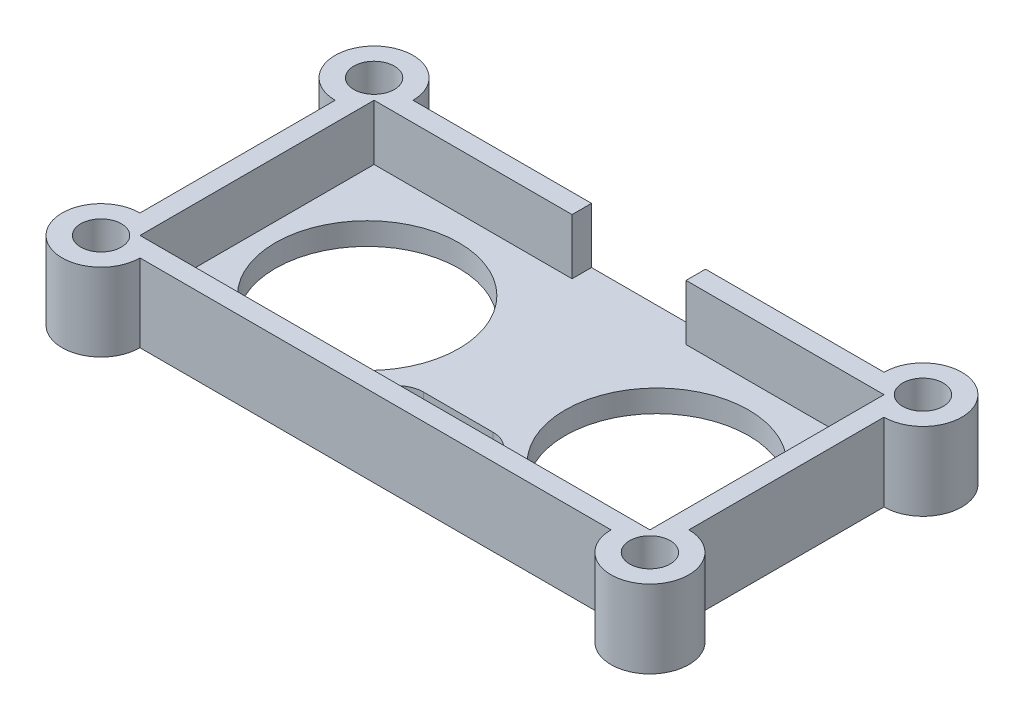
ISO-10303-21;
HEADER;
FILE_DESCRIPTION(('STEP AP214'),'2;1');
FILE_NAME('part.step','',(''),(''),'','','');
FILE_SCHEMA(('AUTOMOTIVE_DESIGN { 1 0 10303 214 1 1 1 1 }'));
ENDSEC;
DATA;
#1=APPLICATION_CONTEXT('core data for automotive mechanical design processes');
#2=APPLICATION_PROTOCOL_DEFINITION('international standard','automotive_design',2000,#1);
#3=PRODUCT_CONTEXT('',#1,'mechanical');
#4=PRODUCT('Part','Part','',(#3));
#5=PRODUCT_RELATED_PRODUCT_CATEGORY('part','',(#4));
#6=PRODUCT_DEFINITION_FORMATION('','',#4);
#7=PRODUCT_DEFINITION_CONTEXT('part definition',#1,'design');
#8=PRODUCT_DEFINITION('design','',#6,#7);
#9=PRODUCT_DEFINITION_SHAPE('','',#8);
#10=(LENGTH_UNIT() NAMED_UNIT(*) SI_UNIT(.MILLI.,.METRE.));
#11=(NAMED_UNIT(*) PLANE_ANGLE_UNIT() SI_UNIT($,.RADIAN.));
#12=(NAMED_UNIT(*) SI_UNIT($,.STERADIAN.) SOLID_ANGLE_UNIT());
#13=UNCERTAINTY_MEASURE_WITH_UNIT(LENGTH_MEASURE(1.E-05),#10,'distance_accuracy_value','');
#14=(GEOMETRIC_REPRESENTATION_CONTEXT(3) GLOBAL_UNCERTAINTY_ASSIGNED_CONTEXT((#13)) GLOBAL_UNIT_ASSIGNED_CONTEXT((#10,
#11,#12)) REPRESENTATION_CONTEXT('',''));
#15=CARTESIAN_POINT('',(0.,0.,0.));
#16=DIRECTION('',(0.,0.,1.));
#17=DIRECTION('',(1.,0.,0.));
#18=AXIS2_PLACEMENT_3D('',#15,#16,#17);
#19=CARTESIAN_POINT('',(-24.675,2.,12.275));
#20=DIRECTION('',(0.,0.,-1.));
#21=DIRECTION('',(-1.,0.,0.));
#22=AXIS2_PLACEMENT_3D('',#19,#20,#21);
#23=PLANE('',#22);
#24=DIRECTION('',(0.,-1.,0.));
#25=VECTOR('',#24,1.);
#26=CARTESIAN_POINT('',(21.175,16.8994949366117,12.275));
#27=LINE('',#26,#25);
#28=CARTESIAN_POINT('',(21.175,7.,12.275));
#29=VERTEX_POINT('',#28);
#30=CARTESIAN_POINT('',(21.175,0.,12.275));
#31=VERTEX_POINT('',#30);
#32=EDGE_CURVE('E250',#29,#31,#27,.T.);
#33=ORIENTED_EDGE('',*,*,#32,.F.);
#34=DIRECTION('',(1.,0.,0.));
#35=VECTOR('',#34,1.);
#36=CARTESIAN_POINT('',(-24.675,7.,12.275));
#37=LINE('',#36,#35);
#38=CARTESIAN_POINT('',(-21.175,7.,12.275));
#39=VERTEX_POINT('',#38);
#40=EDGE_CURVE('E295',#39,#29,#37,.T.);
#41=ORIENTED_EDGE('',*,*,#40,.F.);
#42=DIRECTION('',(0.,-1.,0.));
#43=VECTOR('',#42,1.);
#44=CARTESIAN_POINT('',(-21.175,16.8994949366117,12.275));
#45=LINE('',#44,#43);
#46=CARTESIAN_POINT('',(-21.175,0.,12.275));
#47=VERTEX_POINT('',#46);
#48=EDGE_CURVE('E256',#39,#47,#45,.T.);
#49=ORIENTED_EDGE('',*,*,#48,.T.);
#50=DIRECTION('',(1.,0.,0.));
#51=VECTOR('',#50,1.);
#52=CARTESIAN_POINT('',(-24.675,0.,12.275));
#53=LINE('',#52,#51);
#54=EDGE_CURVE('E362',#47,#31,#53,.T.);
#55=ORIENTED_EDGE('',*,*,#54,.T.);
#56=EDGE_LOOP('',(#33,#41,#49,#55));
#57=FACE_BOUND('',#56,.T.);
#58=ADVANCED_FACE('F33',(#57),#23,.F.);
#59=CARTESIAN_POINT('',(24.675,2.,-12.275));
#60=DIRECTION('',(-1.,0.,0.));
#61=DIRECTION('',(0.,0.,1.));
#62=AXIS2_PLACEMENT_3D('',#59,#60,#61);
#63=PLANE('',#62);
#64=DIRECTION('',(0.,-1.,0.));
#65=VECTOR('',#64,1.);
#66=CARTESIAN_POINT('',(24.675,16.8994949366117,8.775));
#67=LINE('',#66,#65);
#68=CARTESIAN_POINT('',(24.675,7.,8.775));
#69=VERTEX_POINT('',#68);
#70=CARTESIAN_POINT('',(24.675,0.,8.775));
#71=VERTEX_POINT('',#70);
#72=EDGE_CURVE('E245',#69,#71,#67,.T.);
#73=ORIENTED_EDGE('',*,*,#72,.T.);
#74=DIRECTION('',(0.,0.,-1.));
#75=VECTOR('',#74,1.);
#76=CARTESIAN_POINT('',(24.675,0.,-12.275));
#77=LINE('',#76,#75);
#78=CARTESIAN_POINT('',(24.675,0.,-8.775));
#79=VERTEX_POINT('',#78);
#80=EDGE_CURVE('E364',#71,#79,#77,.T.);
#81=ORIENTED_EDGE('',*,*,#80,.T.);
#82=DIRECTION('',(0.,-1.,0.));
#83=VECTOR('',#82,1.);
#84=CARTESIAN_POINT('',(24.675,16.8994949366117,-8.775));
#85=LINE('',#84,#83);
#86=CARTESIAN_POINT('',(24.675,7.,-8.775));
#87=VERTEX_POINT('',#86);
#88=EDGE_CURVE('E267',#87,#79,#85,.T.);
#89=ORIENTED_EDGE('',*,*,#88,.F.);
#90=DIRECTION('',(0.,0.,-1.));
#91=VECTOR('',#90,1.);
#92=CARTESIAN_POINT('',(24.675,7.,12.275));
#93=LINE('',#92,#91);
#94=EDGE_CURVE('E298',#69,#87,#93,.T.);
#95=ORIENTED_EDGE('',*,*,#94,.F.);
#96=EDGE_LOOP('',(#73,#81,#89,#95));
#97=FACE_BOUND('',#96,.T.);
#98=ADVANCED_FACE('F422',(#97),#63,.F.);
#99=CARTESIAN_POINT('',(-24.675,2.,-12.275));
#100=DIRECTION('',(1.,0.,0.));
#101=DIRECTION('',(0.,0.,-1.));
#102=AXIS2_PLACEMENT_3D('',#99,#100,#101);
#103=PLANE('',#102);
#104=DIRECTION('',(0.,-1.,0.));
#105=VECTOR('',#104,1.);
#106=CARTESIAN_POINT('',(-24.675,16.8994949366117,8.775));
#107=LINE('',#106,#105);
#108=CARTESIAN_POINT('',(-24.675,7.,8.775));
#109=VERTEX_POINT('',#108);
#110=CARTESIAN_POINT('',(-24.675,0.,8.775));
#111=VERTEX_POINT('',#110);
#112=EDGE_CURVE('E261',#109,#111,#107,.T.);
#113=ORIENTED_EDGE('',*,*,#112,.F.);
#114=DIRECTION('',(0.,0.,1.));
#115=VECTOR('',#114,1.);
#116=CARTESIAN_POINT('',(-24.675,7.,-12.275));
#117=LINE('',#116,#115);
#118=CARTESIAN_POINT('',(-24.675,7.,-8.775));
#119=VERTEX_POINT('',#118);
#120=EDGE_CURVE('E291',#119,#109,#117,.T.);
#121=ORIENTED_EDGE('',*,*,#120,.F.);
#122=DIRECTION('',(0.,-1.,0.));
#123=VECTOR('',#122,1.);
#124=CARTESIAN_POINT('',(-24.675,16.8994949366117,-8.775));
#125=LINE('',#124,#123);
#126=CARTESIAN_POINT('',(-24.675,0.,-8.775));
#127=VERTEX_POINT('',#126);
#128=EDGE_CURVE('E283',#119,#127,#125,.T.);
#129=ORIENTED_EDGE('',*,*,#128,.T.);
#130=DIRECTION('',(0.,0.,1.));
#131=VECTOR('',#130,1.);
#132=CARTESIAN_POINT('',(-24.675,0.,-12.275));
#133=LINE('',#132,#131);
#134=EDGE_CURVE('E358',#127,#111,#133,.T.);
#135=ORIENTED_EDGE('',*,*,#134,.T.);
#136=EDGE_LOOP('',(#113,#121,#129,#135));
#137=FACE_BOUND('',#136,.T.);
#138=ADVANCED_FACE('F35',(#137),#103,.F.);
#139=CARTESIAN_POINT('',(-24.675,2.,-12.275));
#140=DIRECTION('',(0.,0.,1.));
#141=DIRECTION('',(1.,0.,0.));
#142=AXIS2_PLACEMENT_3D('',#139,#140,#141);
#143=PLANE('',#142);
#144=DIRECTION('',(0.,-1.,0.));
#145=VECTOR('',#144,1.);
#146=CARTESIAN_POINT('',(21.175,16.8994949366117,-12.275));
#147=LINE('',#146,#145);
#148=CARTESIAN_POINT('',(21.175,7.,-12.275));
#149=VERTEX_POINT('',#148);
#150=CARTESIAN_POINT('',(21.175,0.,-12.275));
#151=VERTEX_POINT('',#150);
#152=EDGE_CURVE('E272',#149,#151,#147,.T.);
#153=ORIENTED_EDGE('',*,*,#152,.T.);
#154=DIRECTION('',(-1.,0.,0.));
#155=VECTOR('',#154,1.);
#156=CARTESIAN_POINT('',(-24.675,0.,-12.275));
#157=LINE('',#156,#155);
#158=CARTESIAN_POINT('',(-21.175,0.,-12.275));
#159=VERTEX_POINT('',#158);
#160=EDGE_CURVE('E37',#151,#159,#157,.T.);
#161=ORIENTED_EDGE('',*,*,#160,.T.);
#162=DIRECTION('',(0.,-1.,0.));
#163=VECTOR('',#162,1.);
#164=CARTESIAN_POINT('',(-21.175,16.8994949366117,-12.275));
#165=LINE('',#164,#163);
#166=CARTESIAN_POINT('',(-21.175,7.,-12.275));
#167=VERTEX_POINT('',#166);
#168=EDGE_CURVE('E279',#167,#159,#165,.T.);
#169=ORIENTED_EDGE('',*,*,#168,.F.);
#170=DIRECTION('',(-1.,0.,0.));
#171=VECTOR('',#170,1.);
#172=CARTESIAN_POINT('',(-5.12499999999999,7.,-12.275));
#173=LINE('',#172,#171);
#174=CARTESIAN_POINT('',(-5.12499999999999,7.,-12.275));
#175=VERTEX_POINT('',#174);
#176=EDGE_CURVE('E288',#175,#167,#173,.T.);
#177=ORIENTED_EDGE('',*,*,#176,.F.);
#178=DIRECTION('',(0.,-1.,0.));
#179=VECTOR('',#178,1.);
#180=CARTESIAN_POINT('',(-5.12499999999999,7.,-12.275));
#181=LINE('',#180,#179);
#182=CARTESIAN_POINT('',(-5.12499999999999,2.,-12.275));
#183=VERTEX_POINT('',#182);
#184=EDGE_CURVE('E316',#175,#183,#181,.T.);
#185=ORIENTED_EDGE('',*,*,#184,.T.);
#186=DIRECTION('',(-1.,0.,0.));
#187=VECTOR('',#186,1.);
#188=CARTESIAN_POINT('',(-24.675,2.,-12.275));
#189=LINE('',#188,#187);
#190=CARTESIAN_POINT('',(5.125,2.,-12.275));
#191=VERTEX_POINT('',#190);
#192=EDGE_CURVE('E11',#191,#183,#189,.T.);
#193=ORIENTED_EDGE('',*,*,#192,.F.);
#194=DIRECTION('',(0.,-1.,0.));
#195=VECTOR('',#194,1.);
#196=CARTESIAN_POINT('',(5.125,7.,-12.275));
#197=LINE('',#196,#195);
#198=CARTESIAN_POINT('',(5.125,7.,-12.275));
#199=VERTEX_POINT('',#198);
#200=EDGE_CURVE('E356',#199,#191,#197,.T.);
#201=ORIENTED_EDGE('',*,*,#200,.F.);
#202=DIRECTION('',(-1.,0.,0.));
#203=VECTOR('',#202,1.);
#204=CARTESIAN_POINT('',(24.675,7.,-12.275));
#205=LINE('',#204,#203);
#206=EDGE_CURVE('E300',#149,#199,#205,.T.);
#207=ORIENTED_EDGE('',*,*,#206,.F.);
#208=EDGE_LOOP('',(#153,#161,#169,#177,#185,#193,#201,#207));
#209=FACE_BOUND('',#208,.T.);
#210=ADVANCED_FACE('F371',(#209),#143,.F.);
#211=CARTESIAN_POINT('',(0.,2.,0.));
#212=DIRECTION('',(0.,1.,0.));
#213=DIRECTION('',(0.,0.,1.));
#214=AXIS2_PLACEMENT_3D('',#211,#212,#213);
#215=PLANE('',#214);
#216=CARTESIAN_POINT('',(13.025,2.,0.));
#217=DIRECTION('',(0.,1.,0.));
#218=DIRECTION('',(0.,0.,1.));
#219=AXIS2_PLACEMENT_3D('',#216,#217,#218);
#220=CIRCLE('',#219,8.25);
#221=CARTESIAN_POINT('',(13.025,2.,8.25));
#222=VERTEX_POINT('',#221);
#223=EDGE_CURVE('E239',#222,#222,#220,.T.);
#224=ORIENTED_EDGE('',*,*,#223,.F.);
#225=EDGE_LOOP('',(#224));
#226=FACE_BOUND('',#225,.T.);
#227=CARTESIAN_POINT('',(-2.99999999999999,2.,7.35));
#228=DIRECTION('',(0.,1.,0.));
#229=DIRECTION('',(0.,0.,1.));
#230=AXIS2_PLACEMENT_3D('',#227,#228,#229);
#231=CIRCLE('',#230,2.375);
#232=CARTESIAN_POINT('',(-2.99999999999999,2.,4.975));
#233=VERTEX_POINT('',#232);
#234=CARTESIAN_POINT('',(-2.99999999999999,2.,9.725));
#235=VERTEX_POINT('',#234);
#236=EDGE_CURVE('E176',#233,#235,#231,.T.);
#237=ORIENTED_EDGE('',*,*,#236,.F.);
#238=DIRECTION('',(-1.,0.,0.));
#239=VECTOR('',#238,1.);
#240=CARTESIAN_POINT('',(0.,2.,4.975));
#241=LINE('',#240,#239);
#242=CARTESIAN_POINT('',(3.25000000000001,2.,4.975));
#243=VERTEX_POINT('',#242);
#244=EDGE_CURVE('E236',#243,#233,#241,.T.);
#245=ORIENTED_EDGE('',*,*,#244,.F.);
#246=CARTESIAN_POINT('',(3.25000000000001,2.,7.35));
#247=DIRECTION('',(0.,1.,0.));
#248=DIRECTION('',(0.,0.,1.));
#249=AXIS2_PLACEMENT_3D('',#246,#247,#248);
#250=CIRCLE('',#249,2.375);
#251=CARTESIAN_POINT('',(3.25000000000001,2.,9.725));
#252=VERTEX_POINT('',#251);
#253=EDGE_CURVE('E234',#252,#243,#250,.T.);
#254=ORIENTED_EDGE('',*,*,#253,.F.);
#255=DIRECTION('',(1.,0.,0.));
#256=VECTOR('',#255,1.);
#257=CARTESIAN_POINT('',(0.,2.,9.725));
#258=LINE('',#257,#256);
#259=EDGE_CURVE('E232',#235,#252,#258,.T.);
#260=ORIENTED_EDGE('',*,*,#259,.F.);
#261=EDGE_LOOP('',(#237,#245,#254,#260));
#262=FACE_BOUND('',#261,.T.);
#263=CARTESIAN_POINT('',(-13.025,2.,0.));
#264=DIRECTION('',(0.,1.,0.));
#265=DIRECTION('',(0.,0.,1.));
#266=AXIS2_PLACEMENT_3D('',#263,#264,#265);
#267=CIRCLE('',#266,8.25);
#268=CARTESIAN_POINT('',(-13.025,2.,8.25));
#269=VERTEX_POINT('',#268);
#270=EDGE_CURVE('E229',#269,#269,#267,.T.);
#271=ORIENTED_EDGE('',*,*,#270,.F.);
#272=EDGE_LOOP('',(#271));
#273=FACE_BOUND('',#272,.T.);
#274=DIRECTION('',(0.,0.,-1.));
#275=VECTOR('',#274,1.);
#276=CARTESIAN_POINT('',(-5.12499999999999,2.,-10.525));
#277=LINE('',#276,#275);
#278=CARTESIAN_POINT('',(-5.12499999999999,2.,-10.525));
#279=VERTEX_POINT('',#278);
#280=EDGE_CURVE('E292',#279,#183,#277,.T.);
#281=ORIENTED_EDGE('',*,*,#280,.F.);
#282=DIRECTION('',(1.,0.,0.));
#283=VECTOR('',#282,1.);
#284=CARTESIAN_POINT('',(-22.925,2.,-10.525));
#285=LINE('',#284,#283);
#286=CARTESIAN_POINT('',(-22.925,2.,-10.525));
#287=VERTEX_POINT('',#286);
#288=EDGE_CURVE('E331',#287,#279,#285,.T.);
#289=ORIENTED_EDGE('',*,*,#288,.F.);
#290=DIRECTION('',(0.,0.,-1.));
#291=VECTOR('',#290,1.);
#292=CARTESIAN_POINT('',(-22.925,2.,10.525));
#293=LINE('',#292,#291);
#294=CARTESIAN_POINT('',(-22.925,2.,10.525));
#295=VERTEX_POINT('',#294);
#296=EDGE_CURVE('E328',#295,#287,#293,.T.);
#297=ORIENTED_EDGE('',*,*,#296,.F.);
#298=DIRECTION('',(-1.,0.,0.));
#299=VECTOR('',#298,1.);
#300=CARTESIAN_POINT('',(22.925,2.,10.525));
#301=LINE('',#300,#299);
#302=CARTESIAN_POINT('',(22.925,2.,10.525));
#303=VERTEX_POINT('',#302);
#304=EDGE_CURVE('E325',#303,#295,#301,.T.);
#305=ORIENTED_EDGE('',*,*,#304,.F.);
#306=DIRECTION('',(0.,0.,1.));
#307=VECTOR('',#306,1.);
#308=CARTESIAN_POINT('',(22.925,2.,-10.525));
#309=LINE('',#308,#307);
#310=CARTESIAN_POINT('',(22.925,2.,-10.525));
#311=VERTEX_POINT('',#310);
#312=EDGE_CURVE('E322',#311,#303,#309,.T.);
#313=ORIENTED_EDGE('',*,*,#312,.F.);
#314=DIRECTION('',(1.,0.,0.));
#315=VECTOR('',#314,1.);
#316=CARTESIAN_POINT('',(5.125,2.,-10.525));
#317=LINE('',#316,#315);
#318=CARTESIAN_POINT('',(5.125,2.,-10.525));
#319=VERTEX_POINT('',#318);
#320=EDGE_CURVE('E319',#319,#311,#317,.T.);
#321=ORIENTED_EDGE('',*,*,#320,.F.);
#322=DIRECTION('',(0.,0.,1.));
#323=VECTOR('',#322,1.);
#324=CARTESIAN_POINT('',(5.125,2.,-12.275));
#325=LINE('',#324,#323);
#326=EDGE_CURVE('E282',#191,#319,#325,.T.);
#327=ORIENTED_EDGE('',*,*,#326,.F.);
#328=ORIENTED_EDGE('',*,*,#192,.T.);
#329=EDGE_LOOP('',(#281,#289,#297,#305,#313,#321,#327,#328));
#330=FACE_BOUND('',#329,.T.);
#331=ADVANCED_FACE('F394',(#226,#262,#273,#330),#215,.T.);
#332=CARTESIAN_POINT('',(0.,0.,0.));
#333=DIRECTION('',(0.,1.,0.));
#334=DIRECTION('',(0.,0.,1.));
#335=AXIS2_PLACEMENT_3D('',#332,#333,#334);
#336=PLANE('',#335);
#337=CARTESIAN_POINT('',(24.675,0.,12.275));
#338=DIRECTION('',(0.,1.,0.));
#339=DIRECTION('',(0.,0.,1.));
#340=AXIS2_PLACEMENT_3D('',#337,#338,#339);
#341=CIRCLE('',#340,1.825);
#342=CARTESIAN_POINT('',(24.675,0.,14.1));
#343=VERTEX_POINT('',#342);
#344=EDGE_CURVE('E219',#343,#343,#341,.T.);
#345=ORIENTED_EDGE('',*,*,#344,.T.);
#346=EDGE_LOOP('',(#345));
#347=FACE_BOUND('',#346,.T.);
#348=CARTESIAN_POINT('',(24.675,0.,-12.275));
#349=DIRECTION('',(0.,1.,0.));
#350=DIRECTION('',(0.,0.,1.));
#351=AXIS2_PLACEMENT_3D('',#348,#349,#350);
#352=CIRCLE('',#351,1.825);
#353=CARTESIAN_POINT('',(24.675,0.,-10.45));
#354=VERTEX_POINT('',#353);
#355=EDGE_CURVE('E213',#354,#354,#352,.T.);
#356=ORIENTED_EDGE('',*,*,#355,.T.);
#357=EDGE_LOOP('',(#356));
#358=FACE_BOUND('',#357,.T.);
#359=CARTESIAN_POINT('',(-24.675,0.,-12.275));
#360=DIRECTION('',(0.,1.,0.));
#361=DIRECTION('',(0.,0.,1.));
#362=AXIS2_PLACEMENT_3D('',#359,#360,#361);
#363=CIRCLE('',#362,1.825);
#364=CARTESIAN_POINT('',(-24.675,0.,-10.45));
#365=VERTEX_POINT('',#364);
#366=EDGE_CURVE('E208',#365,#365,#363,.T.);
#367=ORIENTED_EDGE('',*,*,#366,.T.);
#368=EDGE_LOOP('',(#367));
#369=FACE_BOUND('',#368,.T.);
#370=CARTESIAN_POINT('',(-24.675,0.,12.275));
#371=DIRECTION('',(0.,1.,0.));
#372=DIRECTION('',(0.,0.,1.));
#373=AXIS2_PLACEMENT_3D('',#370,#371,#372);
#374=CIRCLE('',#373,1.825);
#375=CARTESIAN_POINT('',(-24.675,0.,14.1));
#376=VERTEX_POINT('',#375);
#377=EDGE_CURVE('E189',#376,#376,#374,.T.);
#378=ORIENTED_EDGE('',*,*,#377,.T.);
#379=EDGE_LOOP('',(#378));
#380=FACE_BOUND('',#379,.T.);
#381=CARTESIAN_POINT('',(13.025,0.,0.));
#382=DIRECTION('',(0.,1.,0.));
#383=DIRECTION('',(0.,0.,1.));
#384=AXIS2_PLACEMENT_3D('',#381,#382,#383);
#385=CIRCLE('',#384,8.25);
#386=CARTESIAN_POINT('',(13.025,0.,8.25));
#387=VERTEX_POINT('',#386);
#388=EDGE_CURVE('E199',#387,#387,#385,.T.);
#389=ORIENTED_EDGE('',*,*,#388,.T.);
#390=EDGE_LOOP('',(#389));
#391=FACE_BOUND('',#390,.T.);
#392=DIRECTION('',(-1.,0.,0.));
#393=VECTOR('',#392,1.);
#394=CARTESIAN_POINT('',(-2.99999999999999,0.,4.975));
#395=LINE('',#394,#393);
#396=CARTESIAN_POINT('',(3.25000000000001,0.,4.975));
#397=VERTEX_POINT('',#396);
#398=CARTESIAN_POINT('',(-2.99999999999999,0.,4.975));
#399=VERTEX_POINT('',#398);
#400=EDGE_CURVE('E179',#397,#399,#395,.T.);
#401=ORIENTED_EDGE('',*,*,#400,.T.);
#402=CARTESIAN_POINT('',(-2.99999999999999,0.,7.35));
#403=DIRECTION('',(0.,1.,0.));
#404=DIRECTION('',(0.,0.,1.));
#405=AXIS2_PLACEMENT_3D('',#402,#403,#404);
#406=CIRCLE('',#405,2.375);
#407=CARTESIAN_POINT('',(-2.99999999999999,0.,9.725));
#408=VERTEX_POINT('',#407);
#409=EDGE_CURVE('E173',#399,#408,#406,.T.);
#410=ORIENTED_EDGE('',*,*,#409,.T.);
#411=DIRECTION('',(1.,0.,0.));
#412=VECTOR('',#411,1.);
#413=CARTESIAN_POINT('',(-2.99999999999999,0.,9.725));
#414=LINE('',#413,#412);
#415=CARTESIAN_POINT('',(3.25000000000001,0.,9.725));
#416=VERTEX_POINT('',#415);
#417=EDGE_CURVE('E182',#408,#416,#414,.T.);
#418=ORIENTED_EDGE('',*,*,#417,.T.);
#419=CARTESIAN_POINT('',(3.25000000000001,0.,7.35));
#420=DIRECTION('',(0.,1.,0.));
#421=DIRECTION('',(0.,0.,1.));
#422=AXIS2_PLACEMENT_3D('',#419,#420,#421);
#423=CIRCLE('',#422,2.375);
#424=EDGE_CURVE('E57',#416,#397,#423,.T.);
#425=ORIENTED_EDGE('',*,*,#424,.T.);
#426=EDGE_LOOP('',(#401,#410,#418,#425));
#427=FACE_BOUND('',#426,.T.);
#428=CARTESIAN_POINT('',(-13.025,0.,0.));
#429=DIRECTION('',(0.,1.,0.));
#430=DIRECTION('',(0.,0.,1.));
#431=AXIS2_PLACEMENT_3D('',#428,#429,#430);
#432=CIRCLE('',#431,8.25);
#433=CARTESIAN_POINT('',(-13.025,0.,8.25));
#434=VERTEX_POINT('',#433);
#435=EDGE_CURVE('E206',#434,#434,#432,.T.);
#436=ORIENTED_EDGE('',*,*,#435,.T.);
#437=EDGE_LOOP('',(#436));
#438=FACE_BOUND('',#437,.T.);
#439=ORIENTED_EDGE('',*,*,#80,.F.);
#440=CARTESIAN_POINT('',(24.675,0.,12.275));
#441=DIRECTION('',(0.,1.,0.));
#442=DIRECTION('',(0.,0.,1.));
#443=AXIS2_PLACEMENT_3D('',#440,#441,#442);
#444=CIRCLE('',#443,3.5);
#445=EDGE_CURVE('E242',#71,#31,#444,.F.);
#446=ORIENTED_EDGE('',*,*,#445,.T.);
#447=ORIENTED_EDGE('',*,*,#54,.F.);
#448=CARTESIAN_POINT('',(-24.675,0.,12.275));
#449=DIRECTION('',(0.,1.,0.));
#450=DIRECTION('',(0.,0.,1.));
#451=AXIS2_PLACEMENT_3D('',#448,#449,#450);
#452=CIRCLE('',#451,3.5);
#453=EDGE_CURVE('E249',#47,#111,#452,.F.);
#454=ORIENTED_EDGE('',*,*,#453,.T.);
#455=ORIENTED_EDGE('',*,*,#134,.F.);
#456=CARTESIAN_POINT('',(-24.675,0.,-12.275));
#457=DIRECTION('',(0.,1.,0.));
#458=DIRECTION('',(0.,0.,1.));
#459=AXIS2_PLACEMENT_3D('',#456,#457,#458);
#460=CIRCLE('',#459,3.5);
#461=EDGE_CURVE('E271',#127,#159,#460,.F.);
#462=ORIENTED_EDGE('',*,*,#461,.T.);
#463=ORIENTED_EDGE('',*,*,#160,.F.);
#464=CARTESIAN_POINT('',(24.675,0.,-12.275));
#465=DIRECTION('',(0.,1.,0.));
#466=DIRECTION('',(0.,0.,1.));
#467=AXIS2_PLACEMENT_3D('',#464,#465,#466);
#468=CIRCLE('',#467,3.5);
#469=EDGE_CURVE('E260',#151,#79,#468,.F.);
#470=ORIENTED_EDGE('',*,*,#469,.T.);
#471=EDGE_LOOP('',(#439,#446,#447,#454,#455,#462,#463,#470));
#472=FACE_BOUND('',#471,.T.);
#473=ADVANCED_FACE('F186',(#347,#358,#369,#380,#391,#427,#438,#472),#336,.F.);
#474=CARTESIAN_POINT('',(5.125,7.,-12.275));
#475=DIRECTION('',(1.,0.,0.));
#476=DIRECTION('',(0.,0.,-1.));
#477=AXIS2_PLACEMENT_3D('',#474,#475,#476);
#478=PLANE('',#477);
#479=ORIENTED_EDGE('',*,*,#326,.T.);
#480=DIRECTION('',(0.,-1.,0.));
#481=VECTOR('',#480,1.);
#482=CARTESIAN_POINT('',(5.125,7.,-10.525));
#483=LINE('',#482,#481);
#484=CARTESIAN_POINT('',(5.125,7.,-10.525));
#485=VERTEX_POINT('',#484);
#486=EDGE_CURVE('E353',#485,#319,#483,.T.);
#487=ORIENTED_EDGE('',*,*,#486,.F.);
#488=DIRECTION('',(0.,0.,1.));
#489=VECTOR('',#488,1.);
#490=CARTESIAN_POINT('',(5.125,7.,-12.275));
#491=LINE('',#490,#489);
#492=EDGE_CURVE('E302',#199,#485,#491,.T.);
#493=ORIENTED_EDGE('',*,*,#492,.F.);
#494=ORIENTED_EDGE('',*,*,#200,.T.);
#495=EDGE_LOOP('',(#479,#487,#493,#494));
#496=FACE_BOUND('',#495,.T.);
#497=ADVANCED_FACE('F417',(#496),#478,.F.);
#498=CARTESIAN_POINT('',(5.125,7.,-10.525));
#499=DIRECTION('',(0.,0.,-1.));
#500=DIRECTION('',(-1.,0.,0.));
#501=AXIS2_PLACEMENT_3D('',#498,#499,#500);
#502=PLANE('',#501);
#503=ORIENTED_EDGE('',*,*,#320,.T.);
#504=DIRECTION('',(0.,-1.,0.));
#505=VECTOR('',#504,1.);
#506=CARTESIAN_POINT('',(22.925,7.,-10.525));
#507=LINE('',#506,#505);
#508=CARTESIAN_POINT('',(22.925,7.,-10.525));
#509=VERTEX_POINT('',#508);
#510=EDGE_CURVE('E350',#509,#311,#507,.T.);
#511=ORIENTED_EDGE('',*,*,#510,.F.);
#512=DIRECTION('',(1.,0.,0.));
#513=VECTOR('',#512,1.);
#514=CARTESIAN_POINT('',(5.125,7.,-10.525));
#515=LINE('',#514,#513);
#516=EDGE_CURVE('E304',#485,#509,#515,.T.);
#517=ORIENTED_EDGE('',*,*,#516,.F.);
#518=ORIENTED_EDGE('',*,*,#486,.T.);
#519=EDGE_LOOP('',(#503,#511,#517,#518));
#520=FACE_BOUND('',#519,.T.);
#521=ADVANCED_FACE('F412',(#520),#502,.F.);
#522=CARTESIAN_POINT('',(22.925,7.,-10.525));
#523=DIRECTION('',(1.,0.,0.));
#524=DIRECTION('',(0.,0.,-1.));
#525=AXIS2_PLACEMENT_3D('',#522,#523,#524);
#526=PLANE('',#525);
#527=ORIENTED_EDGE('',*,*,#312,.T.);
#528=DIRECTION('',(0.,-1.,0.));
#529=VECTOR('',#528,1.);
#530=CARTESIAN_POINT('',(22.925,7.,10.525));
#531=LINE('',#530,#529);
#532=CARTESIAN_POINT('',(22.925,7.,10.525));
#533=VERTEX_POINT('',#532);
#534=EDGE_CURVE('E347',#533,#303,#531,.T.);
#535=ORIENTED_EDGE('',*,*,#534,.F.);
#536=DIRECTION('',(0.,0.,1.));
#537=VECTOR('',#536,1.);
#538=CARTESIAN_POINT('',(22.925,7.,-10.525));
#539=LINE('',#538,#537);
#540=EDGE_CURVE('E306',#509,#533,#539,.T.);
#541=ORIENTED_EDGE('',*,*,#540,.F.);
#542=ORIENTED_EDGE('',*,*,#510,.T.);
#543=EDGE_LOOP('',(#527,#535,#541,#542));
#544=FACE_BOUND('',#543,.T.);
#545=ADVANCED_FACE('F409',(#544),#526,.F.);
#546=CARTESIAN_POINT('',(22.925,7.,10.525));
#547=DIRECTION('',(0.,0.,1.));
#548=DIRECTION('',(1.,0.,0.));
#549=AXIS2_PLACEMENT_3D('',#546,#547,#548);
#550=PLANE('',#549);
#551=ORIENTED_EDGE('',*,*,#304,.T.);
#552=DIRECTION('',(0.,-1.,0.));
#553=VECTOR('',#552,1.);
#554=CARTESIAN_POINT('',(-22.925,7.,10.525));
#555=LINE('',#554,#553);
#556=CARTESIAN_POINT('',(-22.925,7.,10.525));
#557=VERTEX_POINT('',#556);
#558=EDGE_CURVE('E344',#557,#295,#555,.T.);
#559=ORIENTED_EDGE('',*,*,#558,.F.);
#560=DIRECTION('',(-1.,0.,0.));
#561=VECTOR('',#560,1.);
#562=CARTESIAN_POINT('',(22.925,7.,10.525));
#563=LINE('',#562,#561);
#564=EDGE_CURVE('E308',#533,#557,#563,.T.);
#565=ORIENTED_EDGE('',*,*,#564,.F.);
#566=ORIENTED_EDGE('',*,*,#534,.T.);
#567=EDGE_LOOP('',(#551,#559,#565,#566));
#568=FACE_BOUND('',#567,.T.);
#569=ADVANCED_FACE('F404',(#568),#550,.F.);
#570=CARTESIAN_POINT('',(-22.925,7.,10.525));
#571=DIRECTION('',(-1.,0.,0.));
#572=DIRECTION('',(0.,0.,1.));
#573=AXIS2_PLACEMENT_3D('',#570,#571,#572);
#574=PLANE('',#573);
#575=ORIENTED_EDGE('',*,*,#296,.T.);
#576=DIRECTION('',(0.,-1.,0.));
#577=VECTOR('',#576,1.);
#578=CARTESIAN_POINT('',(-22.925,7.,-10.525));
#579=LINE('',#578,#577);
#580=CARTESIAN_POINT('',(-22.925,7.,-10.525));
#581=VERTEX_POINT('',#580);
#582=EDGE_CURVE('E341',#581,#287,#579,.T.);
#583=ORIENTED_EDGE('',*,*,#582,.F.);
#584=DIRECTION('',(0.,0.,-1.));
#585=VECTOR('',#584,1.);
#586=CARTESIAN_POINT('',(-22.925,7.,10.525));
#587=LINE('',#586,#585);
#588=EDGE_CURVE('E310',#557,#581,#587,.T.);
#589=ORIENTED_EDGE('',*,*,#588,.F.);
#590=ORIENTED_EDGE('',*,*,#558,.T.);
#591=EDGE_LOOP('',(#575,#583,#589,#590));
#592=FACE_BOUND('',#591,.T.);
#593=ADVANCED_FACE('F401',(#592),#574,.F.);
#594=CARTESIAN_POINT('',(-22.925,7.,-10.525));
#595=DIRECTION('',(0.,0.,-1.));
#596=DIRECTION('',(-1.,0.,0.));
#597=AXIS2_PLACEMENT_3D('',#594,#595,#596);
#598=PLANE('',#597);
#599=ORIENTED_EDGE('',*,*,#288,.T.);
#600=DIRECTION('',(0.,-1.,0.));
#601=VECTOR('',#600,1.);
#602=CARTESIAN_POINT('',(-5.12499999999999,7.,-10.525));
#603=LINE('',#602,#601);
#604=CARTESIAN_POINT('',(-5.12499999999999,7.,-10.525));
#605=VERTEX_POINT('',#604);
#606=EDGE_CURVE('E338',#605,#279,#603,.T.);
#607=ORIENTED_EDGE('',*,*,#606,.F.);
#608=DIRECTION('',(1.,0.,0.));
#609=VECTOR('',#608,1.);
#610=CARTESIAN_POINT('',(-22.925,7.,-10.525));
#611=LINE('',#610,#609);
#612=EDGE_CURVE('E312',#581,#605,#611,.T.);
#613=ORIENTED_EDGE('',*,*,#612,.F.);
#614=ORIENTED_EDGE('',*,*,#582,.T.);
#615=EDGE_LOOP('',(#599,#607,#613,#614));
#616=FACE_BOUND('',#615,.T.);
#617=ADVANCED_FACE('F396',(#616),#598,.F.);
#618=CARTESIAN_POINT('',(-5.12499999999999,7.,-10.525));
#619=DIRECTION('',(-1.,0.,0.));
#620=DIRECTION('',(0.,0.,1.));
#621=AXIS2_PLACEMENT_3D('',#618,#619,#620);
#622=PLANE('',#621);
#623=ORIENTED_EDGE('',*,*,#280,.T.);
#624=ORIENTED_EDGE('',*,*,#184,.F.);
#625=DIRECTION('',(0.,0.,-1.));
#626=VECTOR('',#625,1.);
#627=CARTESIAN_POINT('',(-5.12499999999999,7.,-10.525));
#628=LINE('',#627,#626);
#629=EDGE_CURVE('E314',#605,#175,#628,.T.);
#630=ORIENTED_EDGE('',*,*,#629,.F.);
#631=ORIENTED_EDGE('',*,*,#606,.T.);
#632=EDGE_LOOP('',(#623,#624,#630,#631));
#633=FACE_BOUND('',#632,.T.);
#634=ADVANCED_FACE('F391',(#633),#622,.F.);
#635=CARTESIAN_POINT('',(0.,7.,0.));
#636=DIRECTION('',(0.,1.,0.));
#637=DIRECTION('',(0.,0.,1.));
#638=AXIS2_PLACEMENT_3D('',#635,#636,#637);
#639=PLANE('',#638);
#640=CARTESIAN_POINT('',(24.675,7.,12.275));
#641=DIRECTION('',(0.,1.,0.));
#642=DIRECTION('',(0.,0.,1.));
#643=AXIS2_PLACEMENT_3D('',#640,#641,#642);
#644=CIRCLE('',#643,1.825);
#645=CARTESIAN_POINT('',(24.675,7.,14.1));
#646=VERTEX_POINT('',#645);
#647=EDGE_CURVE('E222',#646,#646,#644,.T.);
#648=ORIENTED_EDGE('',*,*,#647,.F.);
#649=EDGE_LOOP('',(#648));
#650=FACE_BOUND('',#649,.T.);
#651=CARTESIAN_POINT('',(24.675,7.,-12.275));
#652=DIRECTION('',(0.,1.,0.));
#653=DIRECTION('',(0.,0.,1.));
#654=AXIS2_PLACEMENT_3D('',#651,#652,#653);
#655=CIRCLE('',#654,1.825);
#656=CARTESIAN_POINT('',(24.675,7.,-10.45));
#657=VERTEX_POINT('',#656);
#658=EDGE_CURVE('E216',#657,#657,#655,.T.);
#659=ORIENTED_EDGE('',*,*,#658,.F.);
#660=EDGE_LOOP('',(#659));
#661=FACE_BOUND('',#660,.T.);
#662=CARTESIAN_POINT('',(-24.675,7.,-12.275));
#663=DIRECTION('',(0.,1.,0.));
#664=DIRECTION('',(0.,0.,1.));
#665=AXIS2_PLACEMENT_3D('',#662,#663,#664);
#666=CIRCLE('',#665,1.825);
#667=CARTESIAN_POINT('',(-24.675,7.,-10.45));
#668=VERTEX_POINT('',#667);
#669=EDGE_CURVE('E210',#668,#668,#666,.T.);
#670=ORIENTED_EDGE('',*,*,#669,.F.);
#671=EDGE_LOOP('',(#670));
#672=FACE_BOUND('',#671,.T.);
#673=CARTESIAN_POINT('',(-24.675,7.,12.275));
#674=DIRECTION('',(0.,1.,0.));
#675=DIRECTION('',(0.,0.,1.));
#676=AXIS2_PLACEMENT_3D('',#673,#674,#675);
#677=CIRCLE('',#676,1.825);
#678=CARTESIAN_POINT('',(-24.675,7.,14.1));
#679=VERTEX_POINT('',#678);
#680=EDGE_CURVE('E192',#679,#679,#677,.T.);
#681=ORIENTED_EDGE('',*,*,#680,.F.);
#682=EDGE_LOOP('',(#681));
#683=FACE_BOUND('',#682,.T.);
#684=CARTESIAN_POINT('',(24.675,7.,12.275));
#685=DIRECTION('',(0.,1.,0.));
#686=DIRECTION('',(0.,0.,1.));
#687=AXIS2_PLACEMENT_3D('',#684,#685,#686);
#688=CIRCLE('',#687,3.5);
#689=EDGE_CURVE('E246',#29,#69,#688,.T.);
#690=ORIENTED_EDGE('',*,*,#689,.T.);
#691=ORIENTED_EDGE('',*,*,#94,.T.);
#692=CARTESIAN_POINT('',(24.675,7.,-12.275));
#693=DIRECTION('',(0.,1.,0.));
#694=DIRECTION('',(0.,0.,1.));
#695=AXIS2_PLACEMENT_3D('',#692,#693,#694);
#696=CIRCLE('',#695,3.5);
#697=EDGE_CURVE('E268',#87,#149,#696,.T.);
#698=ORIENTED_EDGE('',*,*,#697,.T.);
#699=ORIENTED_EDGE('',*,*,#206,.T.);
#700=ORIENTED_EDGE('',*,*,#492,.T.);
#701=ORIENTED_EDGE('',*,*,#516,.T.);
#702=ORIENTED_EDGE('',*,*,#540,.T.);
#703=ORIENTED_EDGE('',*,*,#564,.T.);
#704=ORIENTED_EDGE('',*,*,#588,.T.);
#705=ORIENTED_EDGE('',*,*,#612,.T.);
#706=ORIENTED_EDGE('',*,*,#629,.T.);
#707=ORIENTED_EDGE('',*,*,#176,.T.);
#708=CARTESIAN_POINT('',(-24.675,7.,-12.275));
#709=DIRECTION('',(0.,1.,0.));
#710=DIRECTION('',(0.,0.,1.));
#711=AXIS2_PLACEMENT_3D('',#708,#709,#710);
#712=CIRCLE('',#711,3.5);
#713=EDGE_CURVE('E280',#167,#119,#712,.T.);
#714=ORIENTED_EDGE('',*,*,#713,.T.);
#715=ORIENTED_EDGE('',*,*,#120,.T.);
#716=CARTESIAN_POINT('',(-24.675,7.,12.275));
#717=DIRECTION('',(0.,1.,0.));
#718=DIRECTION('',(0.,0.,1.));
#719=AXIS2_PLACEMENT_3D('',#716,#717,#718);
#720=CIRCLE('',#719,3.5);
#721=EDGE_CURVE('E257',#109,#39,#720,.T.);
#722=ORIENTED_EDGE('',*,*,#721,.T.);
#723=ORIENTED_EDGE('',*,*,#40,.T.);
#724=EDGE_LOOP('',(#690,#691,#698,#699,#700,#701,#702,#703,#704,#705,#706,#707,#714,#715,#722,#723));
#725=FACE_BOUND('',#724,.T.);
#726=ADVANCED_FACE('F384',(#650,#661,#672,#683,#725),#639,.T.);
#727=CARTESIAN_POINT('',(-24.675,16.8994949366117,-12.275));
#728=DIRECTION('',(0.,-1.,0.));
#729=DIRECTION('',(0.,0.,-1.));
#730=AXIS2_PLACEMENT_3D('',#727,#728,#729);
#731=CYLINDRICAL_SURFACE('',#730,3.5);
#732=ORIENTED_EDGE('',*,*,#713,.F.);
#733=ORIENTED_EDGE('',*,*,#168,.T.);
#734=ORIENTED_EDGE('',*,*,#461,.F.);
#735=ORIENTED_EDGE('',*,*,#128,.F.);
#736=EDGE_LOOP('',(#732,#733,#734,#735));
#737=FACE_BOUND('',#736,.T.);
#738=ADVANCED_FACE('F376',(#737),#731,.T.);
#739=CARTESIAN_POINT('',(24.675,16.8994949366117,-12.275));
#740=DIRECTION('',(0.,-1.,0.));
#741=DIRECTION('',(0.,0.,-1.));
#742=AXIS2_PLACEMENT_3D('',#739,#740,#741);
#743=CYLINDRICAL_SURFACE('',#742,3.5);
#744=ORIENTED_EDGE('',*,*,#697,.F.);
#745=ORIENTED_EDGE('',*,*,#88,.T.);
#746=ORIENTED_EDGE('',*,*,#469,.F.);
#747=ORIENTED_EDGE('',*,*,#152,.F.);
#748=EDGE_LOOP('',(#744,#745,#746,#747));
#749=FACE_BOUND('',#748,.T.);
#750=ADVANCED_FACE('F421',(#749),#743,.T.);
#751=CARTESIAN_POINT('',(-24.675,16.8994949366117,12.275));
#752=DIRECTION('',(0.,-1.,0.));
#753=DIRECTION('',(0.,0.,-1.));
#754=AXIS2_PLACEMENT_3D('',#751,#752,#753);
#755=CYLINDRICAL_SURFACE('',#754,3.5);
#756=ORIENTED_EDGE('',*,*,#721,.F.);
#757=ORIENTED_EDGE('',*,*,#112,.T.);
#758=ORIENTED_EDGE('',*,*,#453,.F.);
#759=ORIENTED_EDGE('',*,*,#48,.F.);
#760=EDGE_LOOP('',(#756,#757,#758,#759));
#761=FACE_BOUND('',#760,.T.);
#762=ADVANCED_FACE('F427',(#761),#755,.T.);
#763=CARTESIAN_POINT('',(24.675,16.8994949366117,12.275));
#764=DIRECTION('',(0.,-1.,0.));
#765=DIRECTION('',(0.,0.,-1.));
#766=AXIS2_PLACEMENT_3D('',#763,#764,#765);
#767=CYLINDRICAL_SURFACE('',#766,3.5);
#768=ORIENTED_EDGE('',*,*,#689,.F.);
#769=ORIENTED_EDGE('',*,*,#32,.T.);
#770=ORIENTED_EDGE('',*,*,#445,.F.);
#771=ORIENTED_EDGE('',*,*,#72,.F.);
#772=EDGE_LOOP('',(#768,#769,#770,#771));
#773=FACE_BOUND('',#772,.T.);
#774=ADVANCED_FACE('F429',(#773),#767,.T.);
#775=CARTESIAN_POINT('',(-24.675,0.,12.275));
#776=DIRECTION('',(0.,1.,0.));
#777=DIRECTION('',(0.,0.,1.));
#778=AXIS2_PLACEMENT_3D('',#775,#776,#777);
#779=CYLINDRICAL_SURFACE('',#778,1.825);
#780=ORIENTED_EDGE('',*,*,#377,.F.);
#781=EDGE_LOOP('',(#780));
#782=FACE_BOUND('',#781,.T.);
#783=ORIENTED_EDGE('',*,*,#680,.T.);
#784=EDGE_LOOP('',(#783));
#785=FACE_BOUND('',#784,.T.);
#786=ADVANCED_FACE('F435',(#782,#785),#779,.F.);
#787=CARTESIAN_POINT('',(-24.675,0.,-12.275));
#788=DIRECTION('',(0.,1.,0.));
#789=DIRECTION('',(0.,0.,1.));
#790=AXIS2_PLACEMENT_3D('',#787,#788,#789);
#791=CYLINDRICAL_SURFACE('',#790,1.825);
#792=ORIENTED_EDGE('',*,*,#366,.F.);
#793=EDGE_LOOP('',(#792));
#794=FACE_BOUND('',#793,.T.);
#795=ORIENTED_EDGE('',*,*,#669,.T.);
#796=EDGE_LOOP('',(#795));
#797=FACE_BOUND('',#796,.T.);
#798=ADVANCED_FACE('F518',(#794,#797),#791,.F.);
#799=CARTESIAN_POINT('',(24.675,0.,-12.275));
#800=DIRECTION('',(0.,1.,0.));
#801=DIRECTION('',(0.,0.,1.));
#802=AXIS2_PLACEMENT_3D('',#799,#800,#801);
#803=CYLINDRICAL_SURFACE('',#802,1.825);
#804=ORIENTED_EDGE('',*,*,#355,.F.);
#805=EDGE_LOOP('',(#804));
#806=FACE_BOUND('',#805,.T.);
#807=ORIENTED_EDGE('',*,*,#658,.T.);
#808=EDGE_LOOP('',(#807));
#809=FACE_BOUND('',#808,.T.);
#810=ADVANCED_FACE('F528',(#806,#809),#803,.F.);
#811=CARTESIAN_POINT('',(24.675,0.,12.275));
#812=DIRECTION('',(0.,1.,0.));
#813=DIRECTION('',(0.,0.,1.));
#814=AXIS2_PLACEMENT_3D('',#811,#812,#813);
#815=CYLINDRICAL_SURFACE('',#814,1.825);
#816=ORIENTED_EDGE('',*,*,#344,.F.);
#817=EDGE_LOOP('',(#816));
#818=FACE_BOUND('',#817,.T.);
#819=ORIENTED_EDGE('',*,*,#647,.T.);
#820=EDGE_LOOP('',(#819));
#821=FACE_BOUND('',#820,.T.);
#822=ADVANCED_FACE('F538',(#818,#821),#815,.F.);
#823=CARTESIAN_POINT('',(-13.025,0.,0.));
#824=DIRECTION('',(0.,1.,0.));
#825=DIRECTION('',(0.,0.,1.));
#826=AXIS2_PLACEMENT_3D('',#823,#824,#825);
#827=CYLINDRICAL_SURFACE('',#826,8.25);
#828=ORIENTED_EDGE('',*,*,#270,.T.);
#829=EDGE_LOOP('',(#828));
#830=FACE_BOUND('',#829,.T.);
#831=ORIENTED_EDGE('',*,*,#435,.F.);
#832=EDGE_LOOP('',(#831));
#833=FACE_BOUND('',#832,.T.);
#834=ADVANCED_FACE('F548',(#830,#833),#827,.F.);
#835=CARTESIAN_POINT('',(-2.99999999999999,0.,7.35));
#836=DIRECTION('',(0.,1.,0.));
#837=DIRECTION('',(0.,0.,1.));
#838=AXIS2_PLACEMENT_3D('',#835,#836,#837);
#839=CYLINDRICAL_SURFACE('',#838,2.375);
#840=ORIENTED_EDGE('',*,*,#236,.T.);
#841=DIRECTION('',(0.,1.,0.));
#842=VECTOR('',#841,1.);
#843=CARTESIAN_POINT('',(-2.99999999999999,0.,9.725));
#844=LINE('',#843,#842);
#845=EDGE_CURVE('E49',#408,#235,#844,.T.);
#846=ORIENTED_EDGE('',*,*,#845,.F.);
#847=ORIENTED_EDGE('',*,*,#409,.F.);
#848=DIRECTION('',(0.,1.,0.));
#849=VECTOR('',#848,1.);
#850=CARTESIAN_POINT('',(-2.99999999999999,0.,4.975));
#851=LINE('',#850,#849);
#852=EDGE_CURVE('E197',#399,#233,#851,.T.);
#853=ORIENTED_EDGE('',*,*,#852,.T.);
#854=EDGE_LOOP('',(#840,#846,#847,#853));
#855=FACE_BOUND('',#854,.T.);
#856=ADVANCED_FACE('F170',(#855),#839,.F.);
#857=CARTESIAN_POINT('',(-2.99999999999999,0.,4.975));
#858=DIRECTION('',(0.,0.,-1.));
#859=DIRECTION('',(-1.,0.,0.));
#860=AXIS2_PLACEMENT_3D('',#857,#858,#859);
#861=PLANE('',#860);
#862=ORIENTED_EDGE('',*,*,#244,.T.);
#863=ORIENTED_EDGE('',*,*,#852,.F.);
#864=ORIENTED_EDGE('',*,*,#400,.F.);
#865=DIRECTION('',(0.,1.,0.));
#866=VECTOR('',#865,1.);
#867=CARTESIAN_POINT('',(3.25000000000001,0.,4.975));
#868=LINE('',#867,#866);
#869=EDGE_CURVE('E200',#397,#243,#868,.T.);
#870=ORIENTED_EDGE('',*,*,#869,.T.);
#871=EDGE_LOOP('',(#862,#863,#864,#870));
#872=FACE_BOUND('',#871,.T.);
#873=ADVANCED_FACE('F567',(#872),#861,.F.);
#874=CARTESIAN_POINT('',(3.25000000000001,0.,7.35));
#875=DIRECTION('',(0.,1.,0.));
#876=DIRECTION('',(0.,0.,1.));
#877=AXIS2_PLACEMENT_3D('',#874,#875,#876);
#878=CYLINDRICAL_SURFACE('',#877,2.375);
#879=ORIENTED_EDGE('',*,*,#253,.T.);
#880=ORIENTED_EDGE('',*,*,#869,.F.);
#881=ORIENTED_EDGE('',*,*,#424,.F.);
#882=DIRECTION('',(0.,1.,0.));
#883=VECTOR('',#882,1.);
#884=CARTESIAN_POINT('',(3.25000000000001,0.,9.725));
#885=LINE('',#884,#883);
#886=EDGE_CURVE('E178',#416,#252,#885,.T.);
#887=ORIENTED_EDGE('',*,*,#886,.T.);
#888=EDGE_LOOP('',(#879,#880,#881,#887));
#889=FACE_BOUND('',#888,.T.);
#890=ADVANCED_FACE('F576',(#889),#878,.F.);
#891=CARTESIAN_POINT('',(-2.99999999999999,0.,9.725));
#892=DIRECTION('',(0.,0.,1.));
#893=DIRECTION('',(1.,0.,0.));
#894=AXIS2_PLACEMENT_3D('',#891,#892,#893);
#895=PLANE('',#894);
#896=ORIENTED_EDGE('',*,*,#259,.T.);
#897=ORIENTED_EDGE('',*,*,#886,.F.);
#898=ORIENTED_EDGE('',*,*,#417,.F.);
#899=ORIENTED_EDGE('',*,*,#845,.T.);
#900=EDGE_LOOP('',(#896,#897,#898,#899));
#901=FACE_BOUND('',#900,.T.);
#902=ADVANCED_FACE('F183',(#901),#895,.F.);
#903=CARTESIAN_POINT('',(13.025,0.,0.));
#904=DIRECTION('',(0.,1.,0.));
#905=DIRECTION('',(0.,0.,1.));
#906=AXIS2_PLACEMENT_3D('',#903,#904,#905);
#907=CYLINDRICAL_SURFACE('',#906,8.25);
#908=ORIENTED_EDGE('',*,*,#223,.T.);
#909=EDGE_LOOP('',(#908));
#910=FACE_BOUND('',#909,.T.);
#911=ORIENTED_EDGE('',*,*,#388,.F.);
#912=EDGE_LOOP('',(#911));
#913=FACE_BOUND('',#912,.T.);
#914=ADVANCED_FACE('F594',(#910,#913),#907,.F.);
#915=CLOSED_SHELL('',(#58,#98,#138,#210,#331,#473,#497,#521,#545,#569,#593,#617,#634,#726,#738,
#750,#762,#774,#786,#798,#810,#822,#834,#856,#873,#890,#902,#914));
#916=MANIFOLD_SOLID_BREP('B2',#915);
#917=ADVANCED_BREP_SHAPE_REPRESENTATION('',(#18,#916),#14);
#918=SHAPE_DEFINITION_REPRESENTATION(#9,#917);
ENDSEC;
END-ISO-10303-21;
